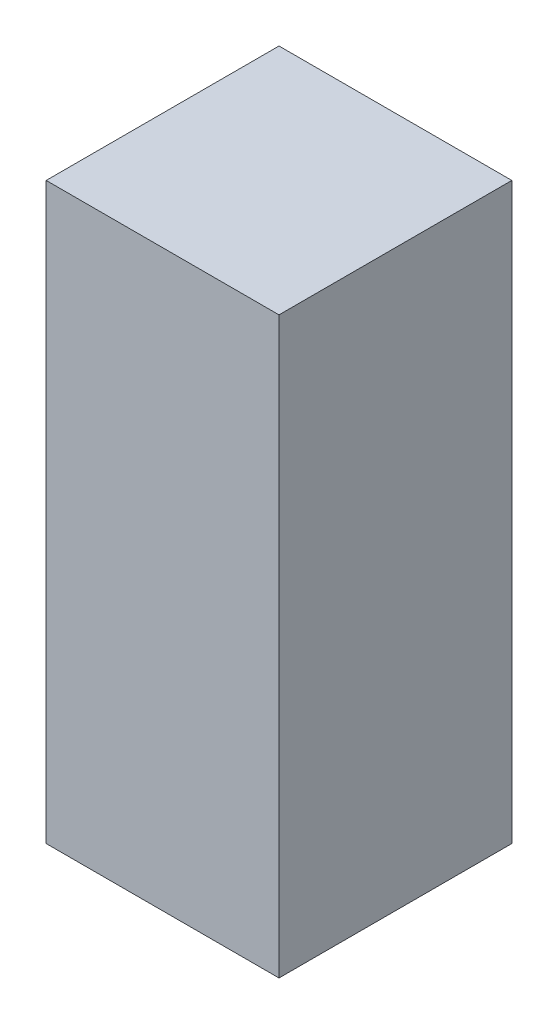
ISO-10303-21;
HEADER;
FILE_DESCRIPTION(('STEP AP214'),'2;1');
FILE_NAME('part.step','',(''),(''),'','','');
FILE_SCHEMA(('AUTOMOTIVE_DESIGN { 1 0 10303 214 1 1 1 1 }'));
ENDSEC;
DATA;
#1=APPLICATION_CONTEXT('core data for automotive mechanical design processes');
#2=APPLICATION_PROTOCOL_DEFINITION('international standard','automotive_design',2000,#1);
#3=PRODUCT_CONTEXT('',#1,'mechanical');
#4=PRODUCT('Part','Part','',(#3));
#5=PRODUCT_RELATED_PRODUCT_CATEGORY('part','',(#4));
#6=PRODUCT_DEFINITION_FORMATION('','',#4);
#7=PRODUCT_DEFINITION_CONTEXT('part definition',#1,'design');
#8=PRODUCT_DEFINITION('design','',#6,#7);
#9=PRODUCT_DEFINITION_SHAPE('','',#8);
#10=(LENGTH_UNIT() NAMED_UNIT(*) SI_UNIT(.MILLI.,.METRE.));
#11=(NAMED_UNIT(*) PLANE_ANGLE_UNIT() SI_UNIT($,.RADIAN.));
#12=(NAMED_UNIT(*) SI_UNIT($,.STERADIAN.) SOLID_ANGLE_UNIT());
#13=UNCERTAINTY_MEASURE_WITH_UNIT(LENGTH_MEASURE(1.E-05),#10,'distance_accuracy_value','');
#14=(GEOMETRIC_REPRESENTATION_CONTEXT(3) GLOBAL_UNCERTAINTY_ASSIGNED_CONTEXT((#13)) GLOBAL_UNIT_ASSIGNED_CONTEXT((#10,
#11,#12)) REPRESENTATION_CONTEXT('',''));
#15=CARTESIAN_POINT('',(0.,0.,0.));
#16=DIRECTION('',(0.,0.,1.));
#17=DIRECTION('',(1.,0.,0.));
#18=AXIS2_PLACEMENT_3D('',#15,#16,#17);
#19=CARTESIAN_POINT('',(-18.6436147103823,93.98,-18.6763453110548));
#20=DIRECTION('',(1.,0.,0.));
#21=DIRECTION('',(0.,0.,-1.));
#22=AXIS2_PLACEMENT_3D('',#19,#20,#21);
#23=PLANE('',#22);
#24=DIRECTION('',(0.,0.,1.));
#25=VECTOR('',#24,1.);
#26=CARTESIAN_POINT('',(-18.6436147103823,0.,-18.6763453110548));
#27=LINE('',#26,#25);
#28=CARTESIAN_POINT('',(-18.6436147103823,0.,-18.6763453110548));
#29=VERTEX_POINT('',#28);
#30=CARTESIAN_POINT('',(-18.6436147103823,0.,19.4236546889452));
#31=VERTEX_POINT('',#30);
#32=EDGE_CURVE('E107',#29,#31,#27,.T.);
#33=ORIENTED_EDGE('',*,*,#32,.T.);
#34=DIRECTION('',(0.,-1.,0.));
#35=VECTOR('',#34,1.);
#36=CARTESIAN_POINT('',(-18.6436147103823,93.98,19.4236546889452));
#37=LINE('',#36,#35);
#38=CARTESIAN_POINT('',(-18.6436147103823,93.98,19.4236546889452));
#39=VERTEX_POINT('',#38);
#40=EDGE_CURVE('E11',#39,#31,#37,.T.);
#41=ORIENTED_EDGE('',*,*,#40,.F.);
#42=DIRECTION('',(0.,0.,1.));
#43=VECTOR('',#42,1.);
#44=CARTESIAN_POINT('',(-18.6436147103823,93.98,-18.6763453110548));
#45=LINE('',#44,#43);
#46=CARTESIAN_POINT('',(-18.6436147103823,93.98,-18.6763453110548));
#47=VERTEX_POINT('',#46);
#48=EDGE_CURVE('E91',#47,#39,#45,.T.);
#49=ORIENTED_EDGE('',*,*,#48,.F.);
#50=DIRECTION('',(0.,-1.,0.));
#51=VECTOR('',#50,1.);
#52=CARTESIAN_POINT('',(-18.6436147103823,93.98,-18.6763453110548));
#53=LINE('',#52,#51);
#54=EDGE_CURVE('E103',#47,#29,#53,.T.);
#55=ORIENTED_EDGE('',*,*,#54,.T.);
#56=EDGE_LOOP('',(#33,#41,#49,#55));
#57=FACE_BOUND('',#56,.T.);
#58=ADVANCED_FACE('F39',(#57),#23,.F.);
#59=CARTESIAN_POINT('',(-18.6436147103823,93.98,19.4236546889452));
#60=DIRECTION('',(0.,0.,-1.));
#61=DIRECTION('',(-1.,0.,0.));
#62=AXIS2_PLACEMENT_3D('',#59,#60,#61);
#63=PLANE('',#62);
#64=DIRECTION('',(1.,0.,0.));
#65=VECTOR('',#64,1.);
#66=CARTESIAN_POINT('',(-18.6436147103823,0.,19.4236546889452));
#67=LINE('',#66,#65);
#68=CARTESIAN_POINT('',(19.4563852896177,0.,19.4236546889452));
#69=VERTEX_POINT('',#68);
#70=EDGE_CURVE('E96',#31,#69,#67,.T.);
#71=ORIENTED_EDGE('',*,*,#70,.T.);
#72=DIRECTION('',(0.,-1.,0.));
#73=VECTOR('',#72,1.);
#74=CARTESIAN_POINT('',(19.4563852896177,93.98,19.4236546889452));
#75=LINE('',#74,#73);
#76=CARTESIAN_POINT('',(19.4563852896177,93.98,19.4236546889452));
#77=VERTEX_POINT('',#76);
#78=EDGE_CURVE('E48',#77,#69,#75,.T.);
#79=ORIENTED_EDGE('',*,*,#78,.F.);
#80=DIRECTION('',(1.,0.,0.));
#81=VECTOR('',#80,1.);
#82=CARTESIAN_POINT('',(-18.6436147103823,93.98,19.4236546889452));
#83=LINE('',#82,#81);
#84=EDGE_CURVE('E86',#39,#77,#83,.T.);
#85=ORIENTED_EDGE('',*,*,#84,.F.);
#86=ORIENTED_EDGE('',*,*,#40,.T.);
#87=EDGE_LOOP('',(#71,#79,#85,#86));
#88=FACE_BOUND('',#87,.T.);
#89=ADVANCED_FACE('F95',(#88),#63,.F.);
#90=CARTESIAN_POINT('',(19.4563852896177,93.98,-18.6763453110548));
#91=DIRECTION('',(-1.,0.,0.));
#92=DIRECTION('',(0.,0.,1.));
#93=AXIS2_PLACEMENT_3D('',#90,#91,#92);
#94=PLANE('',#93);
#95=DIRECTION('',(0.,0.,-1.));
#96=VECTOR('',#95,1.);
#97=CARTESIAN_POINT('',(19.4563852896177,0.,-18.6763453110548));
#98=LINE('',#97,#96);
#99=CARTESIAN_POINT('',(19.4563852896177,0.,-18.6763453110548));
#100=VERTEX_POINT('',#99);
#101=EDGE_CURVE('E73',#69,#100,#98,.T.);
#102=ORIENTED_EDGE('',*,*,#101,.T.);
#103=DIRECTION('',(0.,-1.,0.));
#104=VECTOR('',#103,1.);
#105=CARTESIAN_POINT('',(19.4563852896177,93.98,-18.6763453110548));
#106=LINE('',#105,#104);
#107=CARTESIAN_POINT('',(19.4563852896177,93.98,-18.6763453110548));
#108=VERTEX_POINT('',#107);
#109=EDGE_CURVE('E98',#108,#100,#106,.T.);
#110=ORIENTED_EDGE('',*,*,#109,.F.);
#111=DIRECTION('',(0.,0.,-1.));
#112=VECTOR('',#111,1.);
#113=CARTESIAN_POINT('',(19.4563852896177,93.98,-18.6763453110548));
#114=LINE('',#113,#112);
#115=EDGE_CURVE('E89',#77,#108,#114,.T.);
#116=ORIENTED_EDGE('',*,*,#115,.F.);
#117=ORIENTED_EDGE('',*,*,#78,.T.);
#118=EDGE_LOOP('',(#102,#110,#116,#117));
#119=FACE_BOUND('',#118,.T.);
#120=ADVANCED_FACE('F99',(#119),#94,.F.);
#121=CARTESIAN_POINT('',(-18.6436147103823,93.98,-18.6763453110548));
#122=DIRECTION('',(0.,0.,1.));
#123=DIRECTION('',(1.,0.,0.));
#124=AXIS2_PLACEMENT_3D('',#121,#122,#123);
#125=PLANE('',#124);
#126=DIRECTION('',(-1.,0.,0.));
#127=VECTOR('',#126,1.);
#128=CARTESIAN_POINT('',(-18.6436147103823,0.,-18.6763453110548));
#129=LINE('',#128,#127);
#130=EDGE_CURVE('E79',#100,#29,#129,.T.);
#131=ORIENTED_EDGE('',*,*,#130,.T.);
#132=ORIENTED_EDGE('',*,*,#54,.F.);
#133=DIRECTION('',(-1.,0.,0.));
#134=VECTOR('',#133,1.);
#135=CARTESIAN_POINT('',(-18.6436147103823,93.98,-18.6763453110548));
#136=LINE('',#135,#134);
#137=EDGE_CURVE('E56',#108,#47,#136,.T.);
#138=ORIENTED_EDGE('',*,*,#137,.F.);
#139=ORIENTED_EDGE('',*,*,#109,.T.);
#140=EDGE_LOOP('',(#131,#132,#138,#139));
#141=FACE_BOUND('',#140,.T.);
#142=ADVANCED_FACE('F120',(#141),#125,.F.);
#143=CARTESIAN_POINT('',(0.,93.98,0.));
#144=DIRECTION('',(0.,1.,0.));
#145=DIRECTION('',(0.,0.,1.));
#146=AXIS2_PLACEMENT_3D('',#143,#144,#145);
#147=PLANE('',#146);
#148=ORIENTED_EDGE('',*,*,#48,.T.);
#149=ORIENTED_EDGE('',*,*,#84,.T.);
#150=ORIENTED_EDGE('',*,*,#115,.T.);
#151=ORIENTED_EDGE('',*,*,#137,.T.);
#152=EDGE_LOOP('',(#148,#149,#150,#151));
#153=FACE_BOUND('',#152,.T.);
#154=ADVANCED_FACE('F87',(#153),#147,.T.);
#155=CARTESIAN_POINT('',(0.,0.,0.));
#156=DIRECTION('',(0.,1.,0.));
#157=DIRECTION('',(0.,0.,1.));
#158=AXIS2_PLACEMENT_3D('',#155,#156,#157);
#159=PLANE('',#158);
#160=ORIENTED_EDGE('',*,*,#32,.F.);
#161=ORIENTED_EDGE('',*,*,#130,.F.);
#162=ORIENTED_EDGE('',*,*,#101,.F.);
#163=ORIENTED_EDGE('',*,*,#70,.F.);
#164=EDGE_LOOP('',(#160,#161,#162,#163));
#165=FACE_BOUND('',#164,.T.);
#166=ADVANCED_FACE('F123',(#165),#159,.F.);
#167=CLOSED_SHELL('',(#58,#89,#120,#142,#154,#166));
#168=MANIFOLD_SOLID_BREP('B2',#167);
#169=ADVANCED_BREP_SHAPE_REPRESENTATION('',(#18,#168),#14);
#170=SHAPE_DEFINITION_REPRESENTATION(#9,#169);
ENDSEC;
END-ISO-10303-21;
